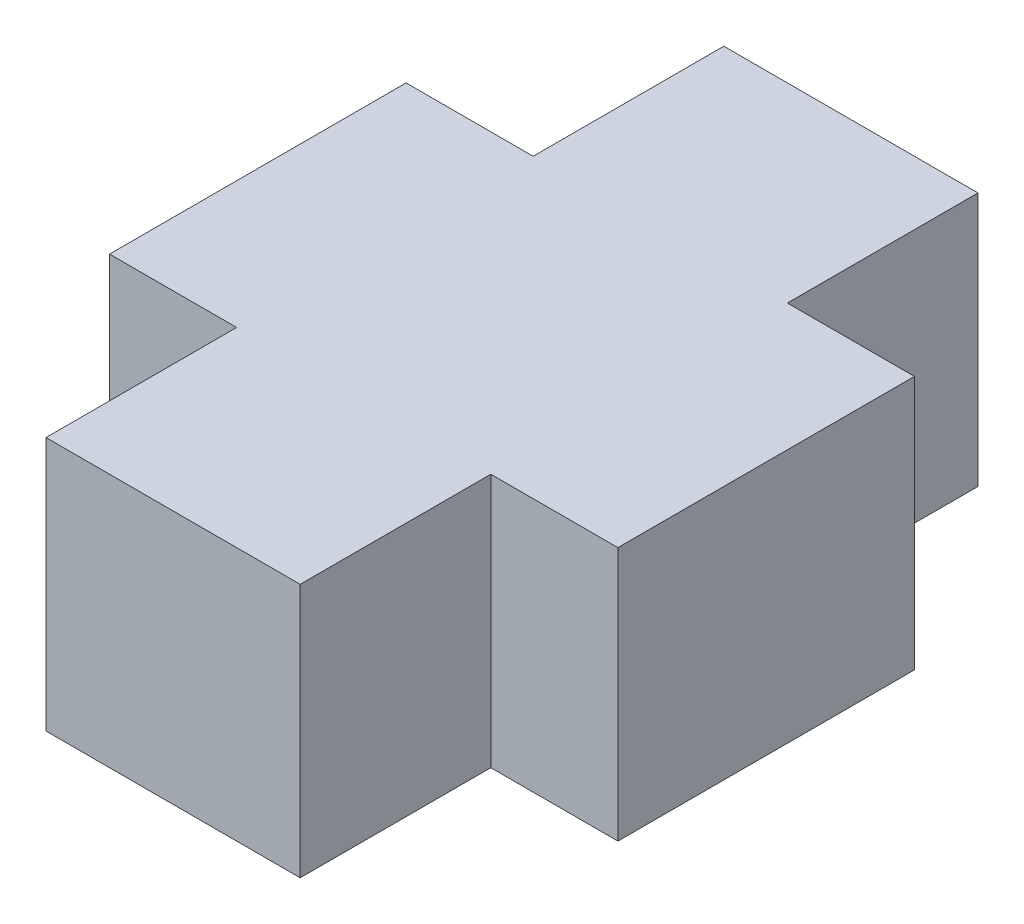
ISO-10303-21;
HEADER;
FILE_DESCRIPTION(('STEP AP214'),'2;1');
FILE_NAME('part.step','',(''),(''),'','','');
FILE_SCHEMA(('AUTOMOTIVE_DESIGN { 1 0 10303 214 1 1 1 1 }'));
ENDSEC;
DATA;
#1=APPLICATION_CONTEXT('core data for automotive mechanical design processes');
#2=APPLICATION_PROTOCOL_DEFINITION('international standard','automotive_design',2000,#1);
#3=PRODUCT_CONTEXT('',#1,'mechanical');
#4=PRODUCT('Part','Part','',(#3));
#5=PRODUCT_RELATED_PRODUCT_CATEGORY('part','',(#4));
#6=PRODUCT_DEFINITION_FORMATION('','',#4);
#7=PRODUCT_DEFINITION_CONTEXT('part definition',#1,'design');
#8=PRODUCT_DEFINITION('design','',#6,#7);
#9=PRODUCT_DEFINITION_SHAPE('','',#8);
#10=(LENGTH_UNIT() NAMED_UNIT(*) SI_UNIT(.MILLI.,.METRE.));
#11=(NAMED_UNIT(*) PLANE_ANGLE_UNIT() SI_UNIT($,.RADIAN.));
#12=(NAMED_UNIT(*) SI_UNIT($,.STERADIAN.) SOLID_ANGLE_UNIT());
#13=UNCERTAINTY_MEASURE_WITH_UNIT(LENGTH_MEASURE(1.E-05),#10,'distance_accuracy_value','');
#14=(GEOMETRIC_REPRESENTATION_CONTEXT(3) GLOBAL_UNCERTAINTY_ASSIGNED_CONTEXT((#13)) GLOBAL_UNIT_ASSIGNED_CONTEXT((#10,
#11,#12)) REPRESENTATION_CONTEXT('',''));
#15=CARTESIAN_POINT('',(0.,0.,0.));
#16=DIRECTION('',(0.,0.,1.));
#17=DIRECTION('',(1.,0.,0.));
#18=AXIS2_PLACEMENT_3D('',#15,#16,#17);
#19=CARTESIAN_POINT('',(38.1,76.2,0.));
#20=DIRECTION('',(-1.,0.,0.));
#21=DIRECTION('',(0.,0.,1.));
#22=AXIS2_PLACEMENT_3D('',#19,#20,#21);
#23=PLANE('',#22);
#24=DIRECTION('',(0.,0.,-1.));
#25=VECTOR('',#24,1.);
#26=CARTESIAN_POINT('',(38.1,0.,0.));
#27=LINE('',#26,#25);
#28=CARTESIAN_POINT('',(38.1,0.,101.6));
#29=VERTEX_POINT('',#28);
#30=CARTESIAN_POINT('',(38.1,0.,44.45));
#31=VERTEX_POINT('',#30);
#32=EDGE_CURVE('E167',#29,#31,#27,.T.);
#33=ORIENTED_EDGE('',*,*,#32,.T.);
#34=DIRECTION('',(0.,-1.,0.));
#35=VECTOR('',#34,1.);
#36=CARTESIAN_POINT('',(38.1,76.2,44.45));
#37=LINE('',#36,#35);
#38=CARTESIAN_POINT('',(38.1,76.2,44.45));
#39=VERTEX_POINT('',#38);
#40=EDGE_CURVE('E11',#39,#31,#37,.T.);
#41=ORIENTED_EDGE('',*,*,#40,.F.);
#42=DIRECTION('',(0.,0.,-1.));
#43=VECTOR('',#42,1.);
#44=CARTESIAN_POINT('',(38.1,76.2,0.));
#45=LINE('',#44,#43);
#46=CARTESIAN_POINT('',(38.1,76.2,101.6));
#47=VERTEX_POINT('',#46);
#48=EDGE_CURVE('E110',#47,#39,#45,.T.);
#49=ORIENTED_EDGE('',*,*,#48,.F.);
#50=DIRECTION('',(0.,-1.,0.));
#51=VECTOR('',#50,1.);
#52=CARTESIAN_POINT('',(38.1,76.2,101.6));
#53=LINE('',#52,#51);
#54=EDGE_CURVE('E163',#47,#29,#53,.T.);
#55=ORIENTED_EDGE('',*,*,#54,.T.);
#56=EDGE_LOOP('',(#33,#41,#49,#55));
#57=FACE_BOUND('',#56,.T.);
#58=ADVANCED_FACE('F45',(#57),#23,.F.);
#59=CARTESIAN_POINT('',(0.,76.2,44.45));
#60=DIRECTION('',(0.,0.,1.));
#61=DIRECTION('',(1.,0.,0.));
#62=AXIS2_PLACEMENT_3D('',#59,#60,#61);
#63=PLANE('',#62);
#64=DIRECTION('',(-1.,0.,0.));
#65=VECTOR('',#64,1.);
#66=CARTESIAN_POINT('',(0.,0.,44.45));
#67=LINE('',#66,#65);
#68=CARTESIAN_POINT('',(76.2,0.,44.45));
#69=VERTEX_POINT('',#68);
#70=EDGE_CURVE('E171',#69,#31,#67,.T.);
#71=ORIENTED_EDGE('',*,*,#70,.F.);
#72=DIRECTION('',(0.,-1.,0.));
#73=VECTOR('',#72,1.);
#74=CARTESIAN_POINT('',(76.2,76.2,44.45));
#75=LINE('',#74,#73);
#76=CARTESIAN_POINT('',(76.2,76.2,44.45));
#77=VERTEX_POINT('',#76);
#78=EDGE_CURVE('E54',#77,#69,#75,.T.);
#79=ORIENTED_EDGE('',*,*,#78,.F.);
#80=DIRECTION('',(-1.,0.,0.));
#81=VECTOR('',#80,1.);
#82=CARTESIAN_POINT('',(0.,76.2,44.45));
#83=LINE('',#82,#81);
#84=EDGE_CURVE('E249',#77,#39,#83,.T.);
#85=ORIENTED_EDGE('',*,*,#84,.T.);
#86=ORIENTED_EDGE('',*,*,#40,.T.);
#87=EDGE_LOOP('',(#71,#79,#85,#86));
#88=FACE_BOUND('',#87,.T.);
#89=ADVANCED_FACE('F248',(#88),#63,.T.);
#90=CARTESIAN_POINT('',(76.2,76.2,0.));
#91=DIRECTION('',(-1.,0.,0.));
#92=DIRECTION('',(0.,0.,1.));
#93=AXIS2_PLACEMENT_3D('',#90,#91,#92);
#94=PLANE('',#93);
#95=DIRECTION('',(0.,0.,-1.));
#96=VECTOR('',#95,1.);
#97=CARTESIAN_POINT('',(76.2,0.,0.));
#98=LINE('',#97,#96);
#99=CARTESIAN_POINT('',(76.2,0.,-44.45));
#100=VERTEX_POINT('',#99);
#101=EDGE_CURVE('E175',#69,#100,#98,.T.);
#102=ORIENTED_EDGE('',*,*,#101,.T.);
#103=DIRECTION('',(0.,-1.,0.));
#104=VECTOR('',#103,1.);
#105=CARTESIAN_POINT('',(76.2,76.2,-44.45));
#106=LINE('',#105,#104);
#107=CARTESIAN_POINT('',(76.2,76.2,-44.45));
#108=VERTEX_POINT('',#107);
#109=EDGE_CURVE('E230',#108,#100,#106,.T.);
#110=ORIENTED_EDGE('',*,*,#109,.F.);
#111=DIRECTION('',(0.,0.,-1.));
#112=VECTOR('',#111,1.);
#113=CARTESIAN_POINT('',(76.2,76.2,0.));
#114=LINE('',#113,#112);
#115=EDGE_CURVE('E239',#77,#108,#114,.T.);
#116=ORIENTED_EDGE('',*,*,#115,.F.);
#117=ORIENTED_EDGE('',*,*,#78,.T.);
#118=EDGE_LOOP('',(#102,#110,#116,#117));
#119=FACE_BOUND('',#118,.T.);
#120=ADVANCED_FACE('F237',(#119),#94,.F.);
#121=CARTESIAN_POINT('',(0.,76.2,-44.45));
#122=DIRECTION('',(0.,0.,1.));
#123=DIRECTION('',(1.,0.,0.));
#124=AXIS2_PLACEMENT_3D('',#121,#122,#123);
#125=PLANE('',#124);
#126=DIRECTION('',(-1.,0.,0.));
#127=VECTOR('',#126,1.);
#128=CARTESIAN_POINT('',(0.,0.,-44.45));
#129=LINE('',#128,#127);
#130=CARTESIAN_POINT('',(38.1,0.,-44.45));
#131=VERTEX_POINT('',#130);
#132=EDGE_CURVE('E178',#100,#131,#129,.T.);
#133=ORIENTED_EDGE('',*,*,#132,.T.);
#134=DIRECTION('',(0.,-1.,0.));
#135=VECTOR('',#134,1.);
#136=CARTESIAN_POINT('',(38.1,76.2,-44.45));
#137=LINE('',#136,#135);
#138=CARTESIAN_POINT('',(38.1,76.2,-44.45));
#139=VERTEX_POINT('',#138);
#140=EDGE_CURVE('E226',#139,#131,#137,.T.);
#141=ORIENTED_EDGE('',*,*,#140,.F.);
#142=DIRECTION('',(-1.,0.,0.));
#143=VECTOR('',#142,1.);
#144=CARTESIAN_POINT('',(0.,76.2,-44.45));
#145=LINE('',#144,#143);
#146=EDGE_CURVE('E281',#108,#139,#145,.T.);
#147=ORIENTED_EDGE('',*,*,#146,.F.);
#148=ORIENTED_EDGE('',*,*,#109,.T.);
#149=EDGE_LOOP('',(#133,#141,#147,#148));
#150=FACE_BOUND('',#149,.T.);
#151=ADVANCED_FACE('F280',(#150),#125,.F.);
#152=CARTESIAN_POINT('',(38.1,76.2,0.));
#153=DIRECTION('',(-1.,0.,0.));
#154=DIRECTION('',(0.,0.,1.));
#155=AXIS2_PLACEMENT_3D('',#152,#153,#154);
#156=PLANE('',#155);
#157=DIRECTION('',(0.,0.,-1.));
#158=VECTOR('',#157,1.);
#159=CARTESIAN_POINT('',(38.1,0.,0.));
#160=LINE('',#159,#158);
#161=CARTESIAN_POINT('',(38.1,0.,-101.6));
#162=VERTEX_POINT('',#161);
#163=EDGE_CURVE('E181',#131,#162,#160,.T.);
#164=ORIENTED_EDGE('',*,*,#163,.T.);
#165=DIRECTION('',(0.,-1.,0.));
#166=VECTOR('',#165,1.);
#167=CARTESIAN_POINT('',(38.1,76.2,-101.6));
#168=LINE('',#167,#166);
#169=CARTESIAN_POINT('',(38.1,76.2,-101.6));
#170=VERTEX_POINT('',#169);
#171=EDGE_CURVE('E223',#170,#162,#168,.T.);
#172=ORIENTED_EDGE('',*,*,#171,.F.);
#173=DIRECTION('',(0.,0.,-1.));
#174=VECTOR('',#173,1.);
#175=CARTESIAN_POINT('',(38.1,76.2,0.));
#176=LINE('',#175,#174);
#177=EDGE_CURVE('E277',#139,#170,#176,.T.);
#178=ORIENTED_EDGE('',*,*,#177,.F.);
#179=ORIENTED_EDGE('',*,*,#140,.T.);
#180=EDGE_LOOP('',(#164,#172,#178,#179));
#181=FACE_BOUND('',#180,.T.);
#182=ADVANCED_FACE('F275',(#181),#156,.F.);
#183=CARTESIAN_POINT('',(0.,76.2,-101.6));
#184=DIRECTION('',(0.,0.,-1.));
#185=DIRECTION('',(-1.,0.,0.));
#186=AXIS2_PLACEMENT_3D('',#183,#184,#185);
#187=PLANE('',#186);
#188=DIRECTION('',(1.,0.,0.));
#189=VECTOR('',#188,1.);
#190=CARTESIAN_POINT('',(0.,0.,-101.6));
#191=LINE('',#190,#189);
#192=CARTESIAN_POINT('',(-38.1,0.,-101.6));
#193=VERTEX_POINT('',#192);
#194=EDGE_CURVE('E185',#193,#162,#191,.T.);
#195=ORIENTED_EDGE('',*,*,#194,.F.);
#196=DIRECTION('',(0.,-1.,0.));
#197=VECTOR('',#196,1.);
#198=CARTESIAN_POINT('',(-38.1,76.2,-101.6));
#199=LINE('',#198,#197);
#200=CARTESIAN_POINT('',(-38.1,76.2,-101.6));
#201=VERTEX_POINT('',#200);
#202=EDGE_CURVE('E220',#201,#193,#199,.T.);
#203=ORIENTED_EDGE('',*,*,#202,.F.);
#204=DIRECTION('',(1.,0.,0.));
#205=VECTOR('',#204,1.);
#206=CARTESIAN_POINT('',(0.,76.2,-101.6));
#207=LINE('',#206,#205);
#208=EDGE_CURVE('E272',#201,#170,#207,.T.);
#209=ORIENTED_EDGE('',*,*,#208,.T.);
#210=ORIENTED_EDGE('',*,*,#171,.T.);
#211=EDGE_LOOP('',(#195,#203,#209,#210));
#212=FACE_BOUND('',#211,.T.);
#213=ADVANCED_FACE('F268',(#212),#187,.T.);
#214=CARTESIAN_POINT('',(-38.1,76.2,0.));
#215=DIRECTION('',(-1.,0.,0.));
#216=DIRECTION('',(0.,0.,1.));
#217=AXIS2_PLACEMENT_3D('',#214,#215,#216);
#218=PLANE('',#217);
#219=DIRECTION('',(0.,0.,-1.));
#220=VECTOR('',#219,1.);
#221=CARTESIAN_POINT('',(-38.1,0.,0.));
#222=LINE('',#221,#220);
#223=CARTESIAN_POINT('',(-38.1,0.,-44.45));
#224=VERTEX_POINT('',#223);
#225=EDGE_CURVE('E189',#224,#193,#222,.T.);
#226=ORIENTED_EDGE('',*,*,#225,.F.);
#227=DIRECTION('',(0.,-1.,0.));
#228=VECTOR('',#227,1.);
#229=CARTESIAN_POINT('',(-38.1,76.2,-44.45));
#230=LINE('',#229,#228);
#231=CARTESIAN_POINT('',(-38.1,76.2,-44.45));
#232=VERTEX_POINT('',#231);
#233=EDGE_CURVE('E217',#232,#224,#230,.T.);
#234=ORIENTED_EDGE('',*,*,#233,.F.);
#235=DIRECTION('',(0.,0.,-1.));
#236=VECTOR('',#235,1.);
#237=CARTESIAN_POINT('',(-38.1,76.2,0.));
#238=LINE('',#237,#236);
#239=EDGE_CURVE('E265',#232,#201,#238,.T.);
#240=ORIENTED_EDGE('',*,*,#239,.T.);
#241=ORIENTED_EDGE('',*,*,#202,.T.);
#242=EDGE_LOOP('',(#226,#234,#240,#241));
#243=FACE_BOUND('',#242,.T.);
#244=ADVANCED_FACE('F264',(#243),#218,.T.);
#245=CARTESIAN_POINT('',(0.,76.2,-44.45));
#246=DIRECTION('',(0.,0.,1.));
#247=DIRECTION('',(1.,0.,0.));
#248=AXIS2_PLACEMENT_3D('',#245,#246,#247);
#249=PLANE('',#248);
#250=DIRECTION('',(-1.,0.,0.));
#251=VECTOR('',#250,1.);
#252=CARTESIAN_POINT('',(0.,0.,-44.45));
#253=LINE('',#252,#251);
#254=CARTESIAN_POINT('',(-76.2,0.,-44.45));
#255=VERTEX_POINT('',#254);
#256=EDGE_CURVE('E193',#224,#255,#253,.T.);
#257=ORIENTED_EDGE('',*,*,#256,.T.);
#258=DIRECTION('',(0.,-1.,0.));
#259=VECTOR('',#258,1.);
#260=CARTESIAN_POINT('',(-76.2,76.2,-44.45));
#261=LINE('',#260,#259);
#262=CARTESIAN_POINT('',(-76.2,76.2,-44.45));
#263=VERTEX_POINT('',#262);
#264=EDGE_CURVE('E214',#263,#255,#261,.T.);
#265=ORIENTED_EDGE('',*,*,#264,.F.);
#266=DIRECTION('',(-1.,0.,0.));
#267=VECTOR('',#266,1.);
#268=CARTESIAN_POINT('',(0.,76.2,-44.45));
#269=LINE('',#268,#267);
#270=EDGE_CURVE('E260',#232,#263,#269,.T.);
#271=ORIENTED_EDGE('',*,*,#270,.F.);
#272=ORIENTED_EDGE('',*,*,#233,.T.);
#273=EDGE_LOOP('',(#257,#265,#271,#272));
#274=FACE_BOUND('',#273,.T.);
#275=ADVANCED_FACE('F259',(#274),#249,.F.);
#276=CARTESIAN_POINT('',(-76.2,76.2,0.));
#277=DIRECTION('',(-1.,0.,0.));
#278=DIRECTION('',(0.,0.,1.));
#279=AXIS2_PLACEMENT_3D('',#276,#277,#278);
#280=PLANE('',#279);
#281=DIRECTION('',(0.,0.,-1.));
#282=VECTOR('',#281,1.);
#283=CARTESIAN_POINT('',(-76.2,0.,0.));
#284=LINE('',#283,#282);
#285=CARTESIAN_POINT('',(-76.2,0.,44.45));
#286=VERTEX_POINT('',#285);
#287=EDGE_CURVE('E197',#286,#255,#284,.T.);
#288=ORIENTED_EDGE('',*,*,#287,.F.);
#289=DIRECTION('',(0.,-1.,0.));
#290=VECTOR('',#289,1.);
#291=CARTESIAN_POINT('',(-76.2,76.2,44.45));
#292=LINE('',#291,#290);
#293=CARTESIAN_POINT('',(-76.2,76.2,44.45));
#294=VERTEX_POINT('',#293);
#295=EDGE_CURVE('E150',#294,#286,#292,.T.);
#296=ORIENTED_EDGE('',*,*,#295,.F.);
#297=DIRECTION('',(0.,0.,-1.));
#298=VECTOR('',#297,1.);
#299=CARTESIAN_POINT('',(-76.2,76.2,0.));
#300=LINE('',#299,#298);
#301=EDGE_CURVE('E156',#294,#263,#300,.T.);
#302=ORIENTED_EDGE('',*,*,#301,.T.);
#303=ORIENTED_EDGE('',*,*,#264,.T.);
#304=EDGE_LOOP('',(#288,#296,#302,#303));
#305=FACE_BOUND('',#304,.T.);
#306=ADVANCED_FACE('F255',(#305),#280,.T.);
#307=CARTESIAN_POINT('',(0.,76.2,44.45));
#308=DIRECTION('',(0.,0.,1.));
#309=DIRECTION('',(1.,0.,0.));
#310=AXIS2_PLACEMENT_3D('',#307,#308,#309);
#311=PLANE('',#310);
#312=DIRECTION('',(-1.,0.,0.));
#313=VECTOR('',#312,1.);
#314=CARTESIAN_POINT('',(0.,0.,44.45));
#315=LINE('',#314,#313);
#316=CARTESIAN_POINT('',(-38.1,0.,44.45));
#317=VERTEX_POINT('',#316);
#318=EDGE_CURVE('E144',#317,#286,#315,.T.);
#319=ORIENTED_EDGE('',*,*,#318,.F.);
#320=DIRECTION('',(0.,-1.,0.));
#321=VECTOR('',#320,1.);
#322=CARTESIAN_POINT('',(-38.1,76.2,44.45));
#323=LINE('',#322,#321);
#324=CARTESIAN_POINT('',(-38.1,76.2,44.45));
#325=VERTEX_POINT('',#324);
#326=EDGE_CURVE('E139',#325,#317,#323,.T.);
#327=ORIENTED_EDGE('',*,*,#326,.F.);
#328=DIRECTION('',(-1.,0.,0.));
#329=VECTOR('',#328,1.);
#330=CARTESIAN_POINT('',(0.,76.2,44.45));
#331=LINE('',#330,#329);
#332=EDGE_CURVE('E142',#325,#294,#331,.T.);
#333=ORIENTED_EDGE('',*,*,#332,.T.);
#334=ORIENTED_EDGE('',*,*,#295,.T.);
#335=EDGE_LOOP('',(#319,#327,#333,#334));
#336=FACE_BOUND('',#335,.T.);
#337=ADVANCED_FACE('F141',(#336),#311,.T.);
#338=CARTESIAN_POINT('',(-38.1,76.2,0.));
#339=DIRECTION('',(-1.,0.,0.));
#340=DIRECTION('',(0.,0.,1.));
#341=AXIS2_PLACEMENT_3D('',#338,#339,#340);
#342=PLANE('',#341);
#343=DIRECTION('',(0.,0.,-1.));
#344=VECTOR('',#343,1.);
#345=CARTESIAN_POINT('',(-38.1,0.,0.));
#346=LINE('',#345,#344);
#347=CARTESIAN_POINT('',(-38.1,0.,101.6));
#348=VERTEX_POINT('',#347);
#349=EDGE_CURVE('E203',#348,#317,#346,.T.);
#350=ORIENTED_EDGE('',*,*,#349,.F.);
#351=DIRECTION('',(0.,-1.,0.));
#352=VECTOR('',#351,1.);
#353=CARTESIAN_POINT('',(-38.1,76.2,101.6));
#354=LINE('',#353,#352);
#355=CARTESIAN_POINT('',(-38.1,76.2,101.6));
#356=VERTEX_POINT('',#355);
#357=EDGE_CURVE('E101',#356,#348,#354,.T.);
#358=ORIENTED_EDGE('',*,*,#357,.F.);
#359=DIRECTION('',(0.,0.,-1.));
#360=VECTOR('',#359,1.);
#361=CARTESIAN_POINT('',(-38.1,76.2,0.));
#362=LINE('',#361,#360);
#363=EDGE_CURVE('E154',#356,#325,#362,.T.);
#364=ORIENTED_EDGE('',*,*,#363,.T.);
#365=ORIENTED_EDGE('',*,*,#326,.T.);
#366=EDGE_LOOP('',(#350,#358,#364,#365));
#367=FACE_BOUND('',#366,.T.);
#368=ADVANCED_FACE('F159',(#367),#342,.T.);
#369=CARTESIAN_POINT('',(0.,76.2,101.6));
#370=DIRECTION('',(0.,0.,-1.));
#371=DIRECTION('',(-1.,0.,0.));
#372=AXIS2_PLACEMENT_3D('',#369,#370,#371);
#373=PLANE('',#372);
#374=DIRECTION('',(1.,0.,0.));
#375=VECTOR('',#374,1.);
#376=CARTESIAN_POINT('',(0.,0.,101.6));
#377=LINE('',#376,#375);
#378=EDGE_CURVE('E104',#348,#29,#377,.T.);
#379=ORIENTED_EDGE('',*,*,#378,.T.);
#380=ORIENTED_EDGE('',*,*,#54,.F.);
#381=DIRECTION('',(1.,0.,0.));
#382=VECTOR('',#381,1.);
#383=CARTESIAN_POINT('',(0.,76.2,101.6));
#384=LINE('',#383,#382);
#385=EDGE_CURVE('E62',#356,#47,#384,.T.);
#386=ORIENTED_EDGE('',*,*,#385,.F.);
#387=ORIENTED_EDGE('',*,*,#357,.T.);
#388=EDGE_LOOP('',(#379,#380,#386,#387));
#389=FACE_BOUND('',#388,.T.);
#390=ADVANCED_FACE('F378',(#389),#373,.F.);
#391=CARTESIAN_POINT('',(0.,76.2,0.));
#392=DIRECTION('',(0.,1.,0.));
#393=DIRECTION('',(0.,0.,1.));
#394=AXIS2_PLACEMENT_3D('',#391,#392,#393);
#395=PLANE('',#394);
#396=ORIENTED_EDGE('',*,*,#48,.T.);
#397=ORIENTED_EDGE('',*,*,#84,.F.);
#398=ORIENTED_EDGE('',*,*,#115,.T.);
#399=ORIENTED_EDGE('',*,*,#146,.T.);
#400=ORIENTED_EDGE('',*,*,#177,.T.);
#401=ORIENTED_EDGE('',*,*,#208,.F.);
#402=ORIENTED_EDGE('',*,*,#239,.F.);
#403=ORIENTED_EDGE('',*,*,#270,.T.);
#404=ORIENTED_EDGE('',*,*,#301,.F.);
#405=ORIENTED_EDGE('',*,*,#332,.F.);
#406=ORIENTED_EDGE('',*,*,#363,.F.);
#407=ORIENTED_EDGE('',*,*,#385,.T.);
#408=EDGE_LOOP('',(#396,#397,#398,#399,#400,#401,#402,#403,#404,#405,#406,#407));
#409=FACE_BOUND('',#408,.T.);
#410=ADVANCED_FACE('F153',(#409),#395,.T.);
#411=CARTESIAN_POINT('',(0.,0.,0.));
#412=DIRECTION('',(0.,1.,0.));
#413=DIRECTION('',(0.,0.,1.));
#414=AXIS2_PLACEMENT_3D('',#411,#412,#413);
#415=PLANE('',#414);
#416=ORIENTED_EDGE('',*,*,#32,.F.);
#417=ORIENTED_EDGE('',*,*,#378,.F.);
#418=ORIENTED_EDGE('',*,*,#349,.T.);
#419=ORIENTED_EDGE('',*,*,#318,.T.);
#420=ORIENTED_EDGE('',*,*,#287,.T.);
#421=ORIENTED_EDGE('',*,*,#256,.F.);
#422=ORIENTED_EDGE('',*,*,#225,.T.);
#423=ORIENTED_EDGE('',*,*,#194,.T.);
#424=ORIENTED_EDGE('',*,*,#163,.F.);
#425=ORIENTED_EDGE('',*,*,#132,.F.);
#426=ORIENTED_EDGE('',*,*,#101,.F.);
#427=ORIENTED_EDGE('',*,*,#70,.T.);
#428=EDGE_LOOP('',(#416,#417,#418,#419,#420,#421,#422,#423,#424,#425,#426,#427));
#429=FACE_BOUND('',#428,.T.);
#430=ADVANCED_FACE('F246',(#429),#415,.F.);
#431=CLOSED_SHELL('',(#58,#89,#120,#151,#182,#213,#244,#275,#306,#337,#368,#390,#410,#430));
#432=MANIFOLD_SOLID_BREP('B2',#431);
#433=ADVANCED_BREP_SHAPE_REPRESENTATION('',(#18,#432),#14);
#434=SHAPE_DEFINITION_REPRESENTATION(#9,#433);
ENDSEC;
END-ISO-10303-21;
